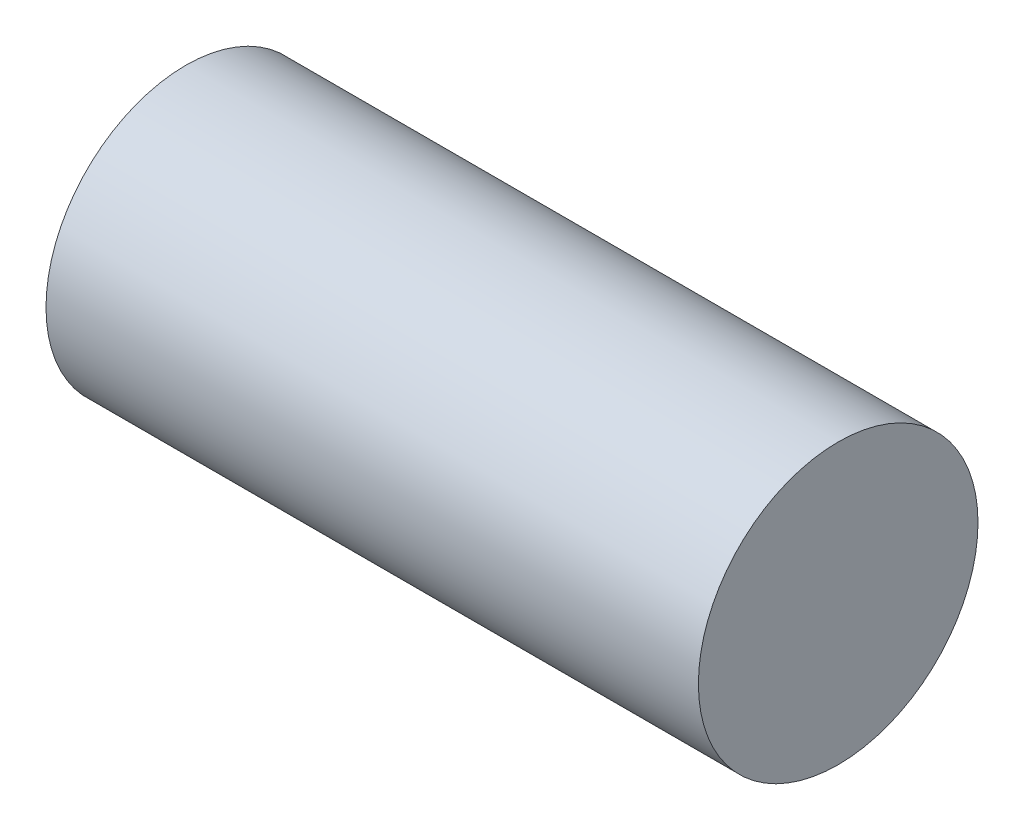
ISO-10303-21;
HEADER;
FILE_DESCRIPTION(('STEP AP214'),'2;1');
FILE_NAME('part.step','',(''),(''),'','','');
FILE_SCHEMA(('AUTOMOTIVE_DESIGN { 1 0 10303 214 1 1 1 1 }'));
ENDSEC;
DATA;
#1=APPLICATION_CONTEXT('core data for automotive mechanical design processes');
#2=APPLICATION_PROTOCOL_DEFINITION('international standard','automotive_design',2000,#1);
#3=PRODUCT_CONTEXT('',#1,'mechanical');
#4=PRODUCT('Part','Part','',(#3));
#5=PRODUCT_RELATED_PRODUCT_CATEGORY('part','',(#4));
#6=PRODUCT_DEFINITION_FORMATION('','',#4);
#7=PRODUCT_DEFINITION_CONTEXT('part definition',#1,'design');
#8=PRODUCT_DEFINITION('design','',#6,#7);
#9=PRODUCT_DEFINITION_SHAPE('','',#8);
#10=(LENGTH_UNIT() NAMED_UNIT(*) SI_UNIT(.MILLI.,.METRE.));
#11=(NAMED_UNIT(*) PLANE_ANGLE_UNIT() SI_UNIT($,.RADIAN.));
#12=(NAMED_UNIT(*) SI_UNIT($,.STERADIAN.) SOLID_ANGLE_UNIT());
#13=UNCERTAINTY_MEASURE_WITH_UNIT(LENGTH_MEASURE(1.E-05),#10,'distance_accuracy_value','');
#14=(GEOMETRIC_REPRESENTATION_CONTEXT(3) GLOBAL_UNCERTAINTY_ASSIGNED_CONTEXT((#13)) GLOBAL_UNIT_ASSIGNED_CONTEXT((#10,
#11,#12)) REPRESENTATION_CONTEXT('',''));
#15=CARTESIAN_POINT('',(0.,0.,0.));
#16=DIRECTION('',(0.,0.,1.));
#17=DIRECTION('',(1.,0.,0.));
#18=AXIS2_PLACEMENT_3D('',#15,#16,#17);
#19=CARTESIAN_POINT('',(70.,0.,0.));
#20=DIRECTION('',(-1.,0.,0.));
#21=DIRECTION('',(0.,0.,1.));
#22=AXIS2_PLACEMENT_3D('',#19,#20,#21);
#23=CYLINDRICAL_SURFACE('',#22,15.);
#24=CARTESIAN_POINT('',(70.,0.,0.));
#25=DIRECTION('',(1.,0.,0.));
#26=DIRECTION('',(0.,0.,-1.));
#27=AXIS2_PLACEMENT_3D('',#24,#25,#26);
#28=CIRCLE('',#27,15.);
#29=CARTESIAN_POINT('',(70.,0.,-15.));
#30=VERTEX_POINT('',#29);
#31=EDGE_CURVE('E10',#30,#30,#28,.T.);
#32=ORIENTED_EDGE('',*,*,#31,.F.);
#33=EDGE_LOOP('',(#32));
#34=FACE_BOUND('',#33,.T.);
#35=CARTESIAN_POINT('',(0.,0.,0.));
#36=DIRECTION('',(1.,0.,0.));
#37=DIRECTION('',(0.,0.,-1.));
#38=AXIS2_PLACEMENT_3D('',#35,#36,#37);
#39=CIRCLE('',#38,15.);
#40=CARTESIAN_POINT('',(0.,0.,-15.));
#41=VERTEX_POINT('',#40);
#42=EDGE_CURVE('E38',#41,#41,#39,.T.);
#43=ORIENTED_EDGE('',*,*,#42,.T.);
#44=EDGE_LOOP('',(#43));
#45=FACE_BOUND('',#44,.T.);
#46=ADVANCED_FACE('F35',(#34,#45),#23,.T.);
#47=CARTESIAN_POINT('',(70.,0.,0.));
#48=DIRECTION('',(1.,0.,0.));
#49=DIRECTION('',(0.,0.,-1.));
#50=AXIS2_PLACEMENT_3D('',#47,#48,#49);
#51=PLANE('',#50);
#52=ORIENTED_EDGE('',*,*,#31,.T.);
#53=EDGE_LOOP('',(#52));
#54=FACE_BOUND('',#53,.T.);
#55=ADVANCED_FACE('F50',(#54),#51,.T.);
#56=CARTESIAN_POINT('',(0.,0.,0.));
#57=DIRECTION('',(1.,0.,0.));
#58=DIRECTION('',(0.,0.,-1.));
#59=AXIS2_PLACEMENT_3D('',#56,#57,#58);
#60=PLANE('',#59);
#61=ORIENTED_EDGE('',*,*,#42,.F.);
#62=EDGE_LOOP('',(#61));
#63=FACE_BOUND('',#62,.T.);
#64=ADVANCED_FACE('F48',(#63),#60,.F.);
#65=CLOSED_SHELL('',(#46,#55,#64));
#66=MANIFOLD_SOLID_BREP('B2',#65);
#67=ADVANCED_BREP_SHAPE_REPRESENTATION('',(#18,#66),#14);
#68=SHAPE_DEFINITION_REPRESENTATION(#9,#67);
ENDSEC;
END-ISO-10303-21;
